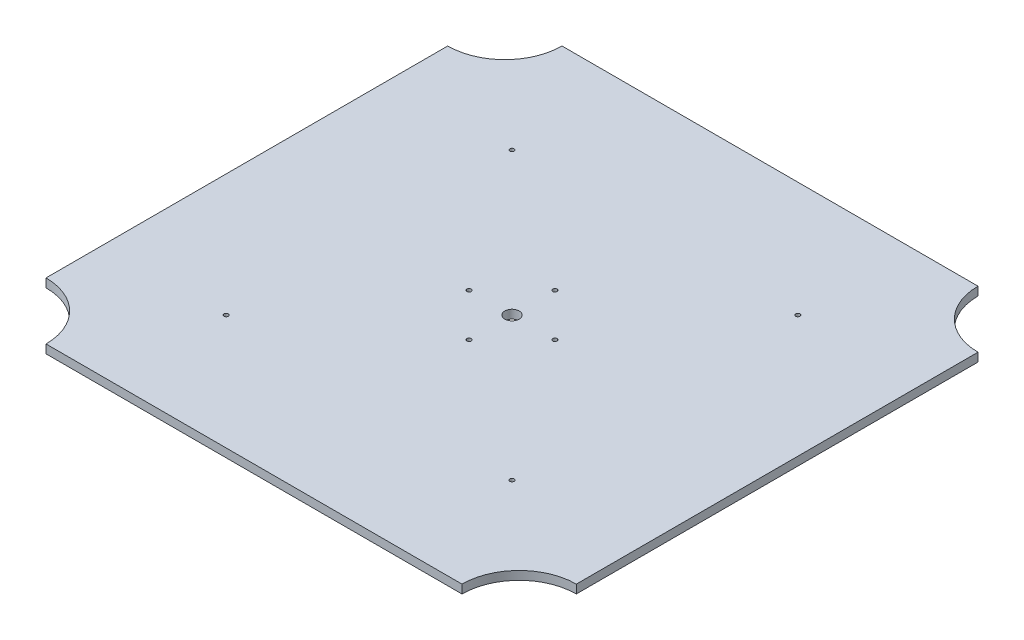
ISO-10303-21;
HEADER;
FILE_DESCRIPTION(('STEP AP214'),'2;1');
FILE_NAME('part.step','',(''),(''),'','','');
FILE_SCHEMA(('AUTOMOTIVE_DESIGN { 1 0 10303 214 1 1 1 1 }'));
ENDSEC;
DATA;
#1=APPLICATION_CONTEXT('core data for automotive mechanical design processes');
#2=APPLICATION_PROTOCOL_DEFINITION('international standard','automotive_design',2000,#1);
#3=PRODUCT_CONTEXT('',#1,'mechanical');
#4=PRODUCT('Part','Part','',(#3));
#5=PRODUCT_RELATED_PRODUCT_CATEGORY('part','',(#4));
#6=PRODUCT_DEFINITION_FORMATION('','',#4);
#7=PRODUCT_DEFINITION_CONTEXT('part definition',#1,'design');
#8=PRODUCT_DEFINITION('design','',#6,#7);
#9=PRODUCT_DEFINITION_SHAPE('','',#8);
#10=(LENGTH_UNIT() NAMED_UNIT(*) SI_UNIT(.MILLI.,.METRE.));
#11=(NAMED_UNIT(*) PLANE_ANGLE_UNIT() SI_UNIT($,.RADIAN.));
#12=(NAMED_UNIT(*) SI_UNIT($,.STERADIAN.) SOLID_ANGLE_UNIT());
#13=UNCERTAINTY_MEASURE_WITH_UNIT(LENGTH_MEASURE(1.E-05),#10,'distance_accuracy_value','');
#14=(GEOMETRIC_REPRESENTATION_CONTEXT(3) GLOBAL_UNCERTAINTY_ASSIGNED_CONTEXT((#13)) GLOBAL_UNIT_ASSIGNED_CONTEXT((#10,
#11,#12)) REPRESENTATION_CONTEXT('',''));
#15=CARTESIAN_POINT('',(0.,0.,0.));
#16=DIRECTION('',(0.,0.,1.));
#17=DIRECTION('',(1.,0.,0.));
#18=AXIS2_PLACEMENT_3D('',#15,#16,#17);
#19=CARTESIAN_POINT('',(-185.5,6.,-180.5));
#20=DIRECTION('',(0.,1.,0.));
#21=DIRECTION('',(0.,0.,1.));
#22=AXIS2_PLACEMENT_3D('',#19,#20,#21);
#23=PLANE('',#22);
#24=CARTESIAN_POINT('',(100.,6.,100.));
#25=DIRECTION('',(0.,1.,0.));
#26=DIRECTION('',(0.,0.,1.));
#27=AXIS2_PLACEMENT_3D('',#24,#25,#26);
#28=CIRCLE('',#27,1.5);
#29=CARTESIAN_POINT('',(100.,6.,101.5));
#30=VERTEX_POINT('',#29);
#31=EDGE_CURVE('E224',#30,#30,#28,.T.);
#32=ORIENTED_EDGE('',*,*,#31,.F.);
#33=EDGE_LOOP('',(#32));
#34=FACE_BOUND('',#33,.T.);
#35=CARTESIAN_POINT('',(-100.,6.,-100.));
#36=DIRECTION('',(0.,1.,0.));
#37=DIRECTION('',(0.,0.,1.));
#38=AXIS2_PLACEMENT_3D('',#35,#36,#37);
#39=CIRCLE('',#38,1.5);
#40=CARTESIAN_POINT('',(-100.,6.,-98.5));
#41=VERTEX_POINT('',#40);
#42=EDGE_CURVE('E212',#41,#41,#39,.T.);
#43=ORIENTED_EDGE('',*,*,#42,.F.);
#44=EDGE_LOOP('',(#43));
#45=FACE_BOUND('',#44,.T.);
#46=CARTESIAN_POINT('',(3.24614485689774E-11,6.,30.));
#47=DIRECTION('',(0.,1.,0.));
#48=DIRECTION('',(0.,0.,1.));
#49=AXIS2_PLACEMENT_3D('',#46,#47,#48);
#50=CIRCLE('',#49,1.50000000003126);
#51=CARTESIAN_POINT('',(3.24614485689774E-11,6.,31.5000000000313));
#52=VERTEX_POINT('',#51);
#53=EDGE_CURVE('E200',#52,#52,#50,.T.);
#54=ORIENTED_EDGE('',*,*,#53,.F.);
#55=EDGE_LOOP('',(#54));
#56=FACE_BOUND('',#55,.T.);
#57=CARTESIAN_POINT('',(0.,6.,-30.));
#58=DIRECTION('',(0.,1.,0.));
#59=DIRECTION('',(0.,0.,1.));
#60=AXIS2_PLACEMENT_3D('',#57,#58,#59);
#61=CIRCLE('',#60,1.5);
#62=CARTESIAN_POINT('',(0.,6.,-28.5));
#63=VERTEX_POINT('',#62);
#64=EDGE_CURVE('E188',#63,#63,#61,.T.);
#65=ORIENTED_EDGE('',*,*,#64,.F.);
#66=EDGE_LOOP('',(#65));
#67=FACE_BOUND('',#66,.T.);
#68=CARTESIAN_POINT('',(-185.5,6.,-180.5));
#69=DIRECTION('',(0.,-1.,0.));
#70=DIRECTION('',(0.,0.,1.));
#71=AXIS2_PLACEMENT_3D('',#68,#69,#70);
#72=CIRCLE('',#71,40.);
#73=CARTESIAN_POINT('',(-145.5,6.,-180.5));
#74=VERTEX_POINT('',#73);
#75=CARTESIAN_POINT('',(-185.5,6.,-140.5));
#76=VERTEX_POINT('',#75);
#77=EDGE_CURVE('E151',#74,#76,#72,.T.);
#78=ORIENTED_EDGE('',*,*,#77,.T.);
#79=DIRECTION('',(0.,0.,1.));
#80=VECTOR('',#79,1.);
#81=CARTESIAN_POINT('',(-185.5,6.,-140.5));
#82=LINE('',#81,#80);
#83=CARTESIAN_POINT('',(-185.5,6.,140.5));
#84=VERTEX_POINT('',#83);
#85=EDGE_CURVE('E99',#76,#84,#82,.T.);
#86=ORIENTED_EDGE('',*,*,#85,.T.);
#87=CARTESIAN_POINT('',(-185.5,6.,180.5));
#88=DIRECTION('',(0.,-1.,0.));
#89=DIRECTION('',(0.,0.,1.));
#90=AXIS2_PLACEMENT_3D('',#87,#88,#89);
#91=CIRCLE('',#90,40.);
#92=CARTESIAN_POINT('',(-145.5,6.,180.5));
#93=VERTEX_POINT('',#92);
#94=EDGE_CURVE('E166',#84,#93,#91,.T.);
#95=ORIENTED_EDGE('',*,*,#94,.T.);
#96=DIRECTION('',(1.,0.,0.));
#97=VECTOR('',#96,1.);
#98=CARTESIAN_POINT('',(-145.5,6.,180.5));
#99=LINE('',#98,#97);
#100=CARTESIAN_POINT('',(145.5,6.,180.5));
#101=VERTEX_POINT('',#100);
#102=EDGE_CURVE('E179',#93,#101,#99,.T.);
#103=ORIENTED_EDGE('',*,*,#102,.T.);
#104=CARTESIAN_POINT('',(185.5,6.,180.5));
#105=DIRECTION('',(0.,-1.,0.));
#106=DIRECTION('',(0.,0.,1.));
#107=AXIS2_PLACEMENT_3D('',#104,#105,#106);
#108=CIRCLE('',#107,40.);
#109=CARTESIAN_POINT('',(185.5,6.,140.5));
#110=VERTEX_POINT('',#109);
#111=EDGE_CURVE('E118',#101,#110,#108,.T.);
#112=ORIENTED_EDGE('',*,*,#111,.T.);
#113=DIRECTION('',(0.,0.,-1.));
#114=VECTOR('',#113,1.);
#115=CARTESIAN_POINT('',(185.5,6.,-140.5));
#116=LINE('',#115,#114);
#117=CARTESIAN_POINT('',(185.5,6.,-140.5));
#118=VERTEX_POINT('',#117);
#119=EDGE_CURVE('E112',#110,#118,#116,.T.);
#120=ORIENTED_EDGE('',*,*,#119,.T.);
#121=CARTESIAN_POINT('',(185.5,6.,-180.5));
#122=DIRECTION('',(0.,-1.,0.));
#123=DIRECTION('',(0.,0.,1.));
#124=AXIS2_PLACEMENT_3D('',#121,#122,#123);
#125=CIRCLE('',#124,40.);
#126=CARTESIAN_POINT('',(145.5,6.,-180.5));
#127=VERTEX_POINT('',#126);
#128=EDGE_CURVE('E116',#118,#127,#125,.T.);
#129=ORIENTED_EDGE('',*,*,#128,.T.);
#130=DIRECTION('',(-1.,0.,0.));
#131=VECTOR('',#130,1.);
#132=CARTESIAN_POINT('',(-145.5,6.,-180.5));
#133=LINE('',#132,#131);
#134=EDGE_CURVE('E56',#127,#74,#133,.T.);
#135=ORIENTED_EDGE('',*,*,#134,.T.);
#136=EDGE_LOOP('',(#78,#86,#95,#103,#112,#120,#129,#135));
#137=FACE_BOUND('',#136,.T.);
#138=CARTESIAN_POINT('',(0.,6.,0.));
#139=DIRECTION('',(0.,1.,0.));
#140=DIRECTION('',(0.,0.,1.));
#141=AXIS2_PLACEMENT_3D('',#138,#139,#140);
#142=CIRCLE('',#141,5.);
#143=CARTESIAN_POINT('',(0.,6.,5.));
#144=VERTEX_POINT('',#143);
#145=EDGE_CURVE('E140',#144,#144,#142,.T.);
#146=ORIENTED_EDGE('',*,*,#145,.F.);
#147=EDGE_LOOP('',(#146));
#148=FACE_BOUND('',#147,.T.);
#149=CARTESIAN_POINT('',(30.0000000000162,6.,-1.62215088173251E-11));
#150=DIRECTION('',(0.,1.,0.));
#151=DIRECTION('',(0.,0.,1.));
#152=AXIS2_PLACEMENT_3D('',#149,#150,#151);
#153=CIRCLE('',#152,1.50000000001089);
#154=CARTESIAN_POINT('',(30.0000000000162,6.,1.49999999999467));
#155=VERTEX_POINT('',#154);
#156=EDGE_CURVE('E194',#155,#155,#153,.T.);
#157=ORIENTED_EDGE('',*,*,#156,.F.);
#158=EDGE_LOOP('',(#157));
#159=FACE_BOUND('',#158,.T.);
#160=CARTESIAN_POINT('',(-29.9999999999838,6.,1.62251827577226E-11));
#161=DIRECTION('',(0.,1.,0.));
#162=DIRECTION('',(0.,0.,1.));
#163=AXIS2_PLACEMENT_3D('',#160,#161,#162);
#164=CIRCLE('',#163,1.50000000002058);
#165=CARTESIAN_POINT('',(-29.9999999999838,6.,1.50000000003681));
#166=VERTEX_POINT('',#165);
#167=EDGE_CURVE('E206',#166,#166,#164,.T.);
#168=ORIENTED_EDGE('',*,*,#167,.F.);
#169=EDGE_LOOP('',(#168));
#170=FACE_BOUND('',#169,.T.);
#171=CARTESIAN_POINT('',(100.,6.,-100.));
#172=DIRECTION('',(0.,1.,0.));
#173=DIRECTION('',(0.,0.,1.));
#174=AXIS2_PLACEMENT_3D('',#171,#172,#173);
#175=CIRCLE('',#174,1.5);
#176=CARTESIAN_POINT('',(100.,6.,-98.5));
#177=VERTEX_POINT('',#176);
#178=EDGE_CURVE('E218',#177,#177,#175,.T.);
#179=ORIENTED_EDGE('',*,*,#178,.F.);
#180=EDGE_LOOP('',(#179));
#181=FACE_BOUND('',#180,.T.);
#182=CARTESIAN_POINT('',(-100.,6.,100.));
#183=DIRECTION('',(0.,1.,0.));
#184=DIRECTION('',(0.,0.,1.));
#185=AXIS2_PLACEMENT_3D('',#182,#183,#184);
#186=CIRCLE('',#185,1.5);
#187=CARTESIAN_POINT('',(-100.,6.,101.5));
#188=VERTEX_POINT('',#187);
#189=EDGE_CURVE('E230',#188,#188,#186,.T.);
#190=ORIENTED_EDGE('',*,*,#189,.F.);
#191=EDGE_LOOP('',(#190));
#192=FACE_BOUND('',#191,.T.);
#193=ADVANCED_FACE('F39',(#34,#45,#56,#67,#137,#148,#159,#170,#181,#192),#23,.T.);
#194=CARTESIAN_POINT('',(-185.5,0.,-180.5));
#195=DIRECTION('',(0.,1.,0.));
#196=DIRECTION('',(0.,0.,1.));
#197=AXIS2_PLACEMENT_3D('',#194,#195,#196);
#198=PLANE('',#197);
#199=CARTESIAN_POINT('',(-185.5,0.,-180.5));
#200=DIRECTION('',(0.,-1.,0.));
#201=DIRECTION('',(0.,0.,1.));
#202=AXIS2_PLACEMENT_3D('',#199,#200,#201);
#203=CIRCLE('',#202,40.);
#204=CARTESIAN_POINT('',(-145.5,0.,-180.5));
#205=VERTEX_POINT('',#204);
#206=CARTESIAN_POINT('',(-185.5,0.,-140.5));
#207=VERTEX_POINT('',#206);
#208=EDGE_CURVE('E136',#205,#207,#203,.T.);
#209=ORIENTED_EDGE('',*,*,#208,.F.);
#210=DIRECTION('',(-1.,0.,0.));
#211=VECTOR('',#210,1.);
#212=CARTESIAN_POINT('',(-145.5,0.,-180.5));
#213=LINE('',#212,#211);
#214=CARTESIAN_POINT('',(145.5,0.,-180.5));
#215=VERTEX_POINT('',#214);
#216=EDGE_CURVE('E91',#215,#205,#213,.T.);
#217=ORIENTED_EDGE('',*,*,#216,.F.);
#218=CARTESIAN_POINT('',(185.5,0.,-180.5));
#219=DIRECTION('',(0.,-1.,0.));
#220=DIRECTION('',(0.,0.,1.));
#221=AXIS2_PLACEMENT_3D('',#218,#219,#220);
#222=CIRCLE('',#221,40.);
#223=CARTESIAN_POINT('',(185.5,0.,-140.5));
#224=VERTEX_POINT('',#223);
#225=EDGE_CURVE('E85',#224,#215,#222,.T.);
#226=ORIENTED_EDGE('',*,*,#225,.F.);
#227=DIRECTION('',(0.,0.,-1.));
#228=VECTOR('',#227,1.);
#229=CARTESIAN_POINT('',(185.5,0.,-140.5));
#230=LINE('',#229,#228);
#231=CARTESIAN_POINT('',(185.5,0.,140.5));
#232=VERTEX_POINT('',#231);
#233=EDGE_CURVE('E126',#232,#224,#230,.T.);
#234=ORIENTED_EDGE('',*,*,#233,.F.);
#235=CARTESIAN_POINT('',(185.5,0.,180.5));
#236=DIRECTION('',(0.,-1.,0.));
#237=DIRECTION('',(0.,0.,1.));
#238=AXIS2_PLACEMENT_3D('',#235,#236,#237);
#239=CIRCLE('',#238,40.);
#240=CARTESIAN_POINT('',(145.5,0.,180.5));
#241=VERTEX_POINT('',#240);
#242=EDGE_CURVE('E146',#241,#232,#239,.T.);
#243=ORIENTED_EDGE('',*,*,#242,.F.);
#244=DIRECTION('',(1.,0.,0.));
#245=VECTOR('',#244,1.);
#246=CARTESIAN_POINT('',(-145.5,0.,180.5));
#247=LINE('',#246,#245);
#248=CARTESIAN_POINT('',(-145.5,0.,180.5));
#249=VERTEX_POINT('',#248);
#250=EDGE_CURVE('E144',#249,#241,#247,.T.);
#251=ORIENTED_EDGE('',*,*,#250,.F.);
#252=CARTESIAN_POINT('',(-185.5,0.,180.5));
#253=DIRECTION('',(0.,-1.,0.));
#254=DIRECTION('',(0.,0.,1.));
#255=AXIS2_PLACEMENT_3D('',#252,#253,#254);
#256=CIRCLE('',#255,40.);
#257=CARTESIAN_POINT('',(-185.5,0.,140.5));
#258=VERTEX_POINT('',#257);
#259=EDGE_CURVE('E142',#258,#249,#256,.T.);
#260=ORIENTED_EDGE('',*,*,#259,.F.);
#261=DIRECTION('',(0.,0.,1.));
#262=VECTOR('',#261,1.);
#263=CARTESIAN_POINT('',(-185.5,0.,-140.5));
#264=LINE('',#263,#262);
#265=EDGE_CURVE('E139',#207,#258,#264,.T.);
#266=ORIENTED_EDGE('',*,*,#265,.F.);
#267=EDGE_LOOP('',(#209,#217,#226,#234,#243,#251,#260,#266));
#268=FACE_BOUND('',#267,.T.);
#269=CARTESIAN_POINT('',(0.,0.,0.));
#270=DIRECTION('',(0.,1.,0.));
#271=DIRECTION('',(0.,0.,1.));
#272=AXIS2_PLACEMENT_3D('',#269,#270,#271);
#273=CIRCLE('',#272,5.);
#274=CARTESIAN_POINT('',(0.,0.,5.));
#275=VERTEX_POINT('',#274);
#276=EDGE_CURVE('E185',#275,#275,#273,.T.);
#277=ORIENTED_EDGE('',*,*,#276,.T.);
#278=EDGE_LOOP('',(#277));
#279=FACE_BOUND('',#278,.T.);
#280=CARTESIAN_POINT('',(0.,0.,-30.));
#281=DIRECTION('',(0.,1.,0.));
#282=DIRECTION('',(0.,0.,1.));
#283=AXIS2_PLACEMENT_3D('',#280,#281,#282);
#284=CIRCLE('',#283,1.5);
#285=CARTESIAN_POINT('',(0.,0.,-28.5));
#286=VERTEX_POINT('',#285);
#287=EDGE_CURVE('E191',#286,#286,#284,.T.);
#288=ORIENTED_EDGE('',*,*,#287,.T.);
#289=EDGE_LOOP('',(#288));
#290=FACE_BOUND('',#289,.T.);
#291=CARTESIAN_POINT('',(30.0000000000162,0.,-1.62215088173251E-11));
#292=DIRECTION('',(0.,1.,0.));
#293=DIRECTION('',(0.,0.,1.));
#294=AXIS2_PLACEMENT_3D('',#291,#292,#293);
#295=CIRCLE('',#294,1.50000000001089);
#296=CARTESIAN_POINT('',(30.0000000000162,0.,1.49999999999467));
#297=VERTEX_POINT('',#296);
#298=EDGE_CURVE('E197',#297,#297,#295,.T.);
#299=ORIENTED_EDGE('',*,*,#298,.T.);
#300=EDGE_LOOP('',(#299));
#301=FACE_BOUND('',#300,.T.);
#302=CARTESIAN_POINT('',(3.24614485689774E-11,0.,30.));
#303=DIRECTION('',(0.,1.,0.));
#304=DIRECTION('',(0.,0.,1.));
#305=AXIS2_PLACEMENT_3D('',#302,#303,#304);
#306=CIRCLE('',#305,1.50000000003126);
#307=CARTESIAN_POINT('',(3.24614485689774E-11,0.,31.5000000000313));
#308=VERTEX_POINT('',#307);
#309=EDGE_CURVE('E203',#308,#308,#306,.T.);
#310=ORIENTED_EDGE('',*,*,#309,.T.);
#311=EDGE_LOOP('',(#310));
#312=FACE_BOUND('',#311,.T.);
#313=CARTESIAN_POINT('',(-29.9999999999838,0.,1.62251827577226E-11));
#314=DIRECTION('',(0.,1.,0.));
#315=DIRECTION('',(0.,0.,1.));
#316=AXIS2_PLACEMENT_3D('',#313,#314,#315);
#317=CIRCLE('',#316,1.50000000002058);
#318=CARTESIAN_POINT('',(-29.9999999999838,0.,1.50000000003681));
#319=VERTEX_POINT('',#318);
#320=EDGE_CURVE('E209',#319,#319,#317,.T.);
#321=ORIENTED_EDGE('',*,*,#320,.T.);
#322=EDGE_LOOP('',(#321));
#323=FACE_BOUND('',#322,.T.);
#324=CARTESIAN_POINT('',(-100.,0.,-100.));
#325=DIRECTION('',(0.,1.,0.));
#326=DIRECTION('',(0.,0.,1.));
#327=AXIS2_PLACEMENT_3D('',#324,#325,#326);
#328=CIRCLE('',#327,1.5);
#329=CARTESIAN_POINT('',(-100.,0.,-98.5));
#330=VERTEX_POINT('',#329);
#331=EDGE_CURVE('E215',#330,#330,#328,.T.);
#332=ORIENTED_EDGE('',*,*,#331,.T.);
#333=EDGE_LOOP('',(#332));
#334=FACE_BOUND('',#333,.T.);
#335=CARTESIAN_POINT('',(100.,0.,-100.));
#336=DIRECTION('',(0.,1.,0.));
#337=DIRECTION('',(0.,0.,1.));
#338=AXIS2_PLACEMENT_3D('',#335,#336,#337);
#339=CIRCLE('',#338,1.5);
#340=CARTESIAN_POINT('',(100.,0.,-98.5));
#341=VERTEX_POINT('',#340);
#342=EDGE_CURVE('E221',#341,#341,#339,.T.);
#343=ORIENTED_EDGE('',*,*,#342,.T.);
#344=EDGE_LOOP('',(#343));
#345=FACE_BOUND('',#344,.T.);
#346=CARTESIAN_POINT('',(100.,0.,100.));
#347=DIRECTION('',(0.,1.,0.));
#348=DIRECTION('',(0.,0.,1.));
#349=AXIS2_PLACEMENT_3D('',#346,#347,#348);
#350=CIRCLE('',#349,1.5);
#351=CARTESIAN_POINT('',(100.,0.,101.5));
#352=VERTEX_POINT('',#351);
#353=EDGE_CURVE('E227',#352,#352,#350,.T.);
#354=ORIENTED_EDGE('',*,*,#353,.T.);
#355=EDGE_LOOP('',(#354));
#356=FACE_BOUND('',#355,.T.);
#357=CARTESIAN_POINT('',(-100.,0.,100.));
#358=DIRECTION('',(0.,1.,0.));
#359=DIRECTION('',(0.,0.,1.));
#360=AXIS2_PLACEMENT_3D('',#357,#358,#359);
#361=CIRCLE('',#360,1.5);
#362=CARTESIAN_POINT('',(-100.,0.,101.5));
#363=VERTEX_POINT('',#362);
#364=EDGE_CURVE('E233',#363,#363,#361,.T.);
#365=ORIENTED_EDGE('',*,*,#364,.T.);
#366=EDGE_LOOP('',(#365));
#367=FACE_BOUND('',#366,.T.);
#368=ADVANCED_FACE('F170',(#268,#279,#290,#301,#312,#323,#334,#345,#356,#367),#198,.F.);
#369=CARTESIAN_POINT('',(-185.5,6.,-180.5));
#370=DIRECTION('',(0.,-1.,0.));
#371=DIRECTION('',(0.,0.,-1.));
#372=AXIS2_PLACEMENT_3D('',#369,#370,#371);
#373=CYLINDRICAL_SURFACE('',#372,40.);
#374=ORIENTED_EDGE('',*,*,#208,.T.);
#375=DIRECTION('',(0.,-1.,0.));
#376=VECTOR('',#375,1.);
#377=CARTESIAN_POINT('',(-185.5,6.,-140.5));
#378=LINE('',#377,#376);
#379=EDGE_CURVE('E11',#76,#207,#378,.T.);
#380=ORIENTED_EDGE('',*,*,#379,.F.);
#381=ORIENTED_EDGE('',*,*,#77,.F.);
#382=DIRECTION('',(0.,-1.,0.));
#383=VECTOR('',#382,1.);
#384=CARTESIAN_POINT('',(-145.5,6.,-180.5));
#385=LINE('',#384,#383);
#386=EDGE_CURVE('E132',#74,#205,#385,.T.);
#387=ORIENTED_EDGE('',*,*,#386,.T.);
#388=EDGE_LOOP('',(#374,#380,#381,#387));
#389=FACE_BOUND('',#388,.T.);
#390=ADVANCED_FACE('F41',(#389),#373,.F.);
#391=CARTESIAN_POINT('',(-185.5,6.,-140.5));
#392=DIRECTION('',(1.,0.,0.));
#393=DIRECTION('',(0.,0.,-1.));
#394=AXIS2_PLACEMENT_3D('',#391,#392,#393);
#395=PLANE('',#394);
#396=ORIENTED_EDGE('',*,*,#265,.T.);
#397=DIRECTION('',(0.,-1.,0.));
#398=VECTOR('',#397,1.);
#399=CARTESIAN_POINT('',(-185.5,6.,140.5));
#400=LINE('',#399,#398);
#401=EDGE_CURVE('E48',#84,#258,#400,.T.);
#402=ORIENTED_EDGE('',*,*,#401,.F.);
#403=ORIENTED_EDGE('',*,*,#85,.F.);
#404=ORIENTED_EDGE('',*,*,#379,.T.);
#405=EDGE_LOOP('',(#396,#402,#403,#404));
#406=FACE_BOUND('',#405,.T.);
#407=ADVANCED_FACE('F267',(#406),#395,.F.);
#408=CARTESIAN_POINT('',(-185.5,6.,180.5));
#409=DIRECTION('',(0.,-1.,0.));
#410=DIRECTION('',(0.,0.,-1.));
#411=AXIS2_PLACEMENT_3D('',#408,#409,#410);
#412=CYLINDRICAL_SURFACE('',#411,40.);
#413=ORIENTED_EDGE('',*,*,#259,.T.);
#414=DIRECTION('',(0.,-1.,0.));
#415=VECTOR('',#414,1.);
#416=CARTESIAN_POINT('',(-145.5,6.,180.5));
#417=LINE('',#416,#415);
#418=EDGE_CURVE('E158',#93,#249,#417,.T.);
#419=ORIENTED_EDGE('',*,*,#418,.F.);
#420=ORIENTED_EDGE('',*,*,#94,.F.);
#421=ORIENTED_EDGE('',*,*,#401,.T.);
#422=EDGE_LOOP('',(#413,#419,#420,#421));
#423=FACE_BOUND('',#422,.T.);
#424=ADVANCED_FACE('F164',(#423),#412,.F.);
#425=CARTESIAN_POINT('',(-145.5,6.,180.5));
#426=DIRECTION('',(0.,0.,-1.));
#427=DIRECTION('',(-1.,0.,0.));
#428=AXIS2_PLACEMENT_3D('',#425,#426,#427);
#429=PLANE('',#428);
#430=ORIENTED_EDGE('',*,*,#250,.T.);
#431=DIRECTION('',(0.,-1.,0.));
#432=VECTOR('',#431,1.);
#433=CARTESIAN_POINT('',(145.5,6.,180.5));
#434=LINE('',#433,#432);
#435=EDGE_CURVE('E155',#101,#241,#434,.T.);
#436=ORIENTED_EDGE('',*,*,#435,.F.);
#437=ORIENTED_EDGE('',*,*,#102,.F.);
#438=ORIENTED_EDGE('',*,*,#418,.T.);
#439=EDGE_LOOP('',(#430,#436,#437,#438));
#440=FACE_BOUND('',#439,.T.);
#441=ADVANCED_FACE('F175',(#440),#429,.F.);
#442=CARTESIAN_POINT('',(185.5,6.,180.5));
#443=DIRECTION('',(0.,-1.,0.));
#444=DIRECTION('',(0.,0.,-1.));
#445=AXIS2_PLACEMENT_3D('',#442,#443,#444);
#446=CYLINDRICAL_SURFACE('',#445,40.);
#447=ORIENTED_EDGE('',*,*,#242,.T.);
#448=DIRECTION('',(0.,-1.,0.));
#449=VECTOR('',#448,1.);
#450=CARTESIAN_POINT('',(185.5,6.,140.5));
#451=LINE('',#450,#449);
#452=EDGE_CURVE('E127',#110,#232,#451,.T.);
#453=ORIENTED_EDGE('',*,*,#452,.F.);
#454=ORIENTED_EDGE('',*,*,#111,.F.);
#455=ORIENTED_EDGE('',*,*,#435,.T.);
#456=EDGE_LOOP('',(#447,#453,#454,#455));
#457=FACE_BOUND('',#456,.T.);
#458=ADVANCED_FACE('F178',(#457),#446,.F.);
#459=CARTESIAN_POINT('',(185.5,6.,-140.5));
#460=DIRECTION('',(-1.,0.,0.));
#461=DIRECTION('',(0.,0.,1.));
#462=AXIS2_PLACEMENT_3D('',#459,#460,#461);
#463=PLANE('',#462);
#464=ORIENTED_EDGE('',*,*,#233,.T.);
#465=DIRECTION('',(0.,-1.,0.));
#466=VECTOR('',#465,1.);
#467=CARTESIAN_POINT('',(185.5,6.,-140.5));
#468=LINE('',#467,#466);
#469=EDGE_CURVE('E123',#118,#224,#468,.T.);
#470=ORIENTED_EDGE('',*,*,#469,.F.);
#471=ORIENTED_EDGE('',*,*,#119,.F.);
#472=ORIENTED_EDGE('',*,*,#452,.T.);
#473=EDGE_LOOP('',(#464,#470,#471,#472));
#474=FACE_BOUND('',#473,.T.);
#475=ADVANCED_FACE('F124',(#474),#463,.F.);
#476=CARTESIAN_POINT('',(185.5,6.,-180.5));
#477=DIRECTION('',(0.,-1.,0.));
#478=DIRECTION('',(0.,0.,-1.));
#479=AXIS2_PLACEMENT_3D('',#476,#477,#478);
#480=CYLINDRICAL_SURFACE('',#479,40.);
#481=ORIENTED_EDGE('',*,*,#225,.T.);
#482=DIRECTION('',(0.,-1.,0.));
#483=VECTOR('',#482,1.);
#484=CARTESIAN_POINT('',(145.5,6.,-180.5));
#485=LINE('',#484,#483);
#486=EDGE_CURVE('E128',#127,#215,#485,.T.);
#487=ORIENTED_EDGE('',*,*,#486,.F.);
#488=ORIENTED_EDGE('',*,*,#128,.F.);
#489=ORIENTED_EDGE('',*,*,#469,.T.);
#490=EDGE_LOOP('',(#481,#487,#488,#489));
#491=FACE_BOUND('',#490,.T.);
#492=ADVANCED_FACE('F130',(#491),#480,.F.);
#493=CARTESIAN_POINT('',(-145.5,6.,-180.5));
#494=DIRECTION('',(0.,0.,1.));
#495=DIRECTION('',(1.,0.,0.));
#496=AXIS2_PLACEMENT_3D('',#493,#494,#495);
#497=PLANE('',#496);
#498=ORIENTED_EDGE('',*,*,#216,.T.);
#499=ORIENTED_EDGE('',*,*,#386,.F.);
#500=ORIENTED_EDGE('',*,*,#134,.F.);
#501=ORIENTED_EDGE('',*,*,#486,.T.);
#502=EDGE_LOOP('',(#498,#499,#500,#501));
#503=FACE_BOUND('',#502,.T.);
#504=ADVANCED_FACE('F255',(#503),#497,.F.);
#505=CARTESIAN_POINT('',(0.,6.,0.));
#506=DIRECTION('',(0.,-1.,0.));
#507=DIRECTION('',(0.,0.,-1.));
#508=AXIS2_PLACEMENT_3D('',#505,#506,#507);
#509=CYLINDRICAL_SURFACE('',#508,5.);
#510=ORIENTED_EDGE('',*,*,#145,.T.);
#511=EDGE_LOOP('',(#510));
#512=FACE_BOUND('',#511,.T.);
#513=ORIENTED_EDGE('',*,*,#276,.F.);
#514=EDGE_LOOP('',(#513));
#515=FACE_BOUND('',#514,.T.);
#516=ADVANCED_FACE('F252',(#512,#515),#509,.F.);
#517=CARTESIAN_POINT('',(0.,6.,-30.));
#518=DIRECTION('',(0.,-1.,0.));
#519=DIRECTION('',(0.,0.,-1.));
#520=AXIS2_PLACEMENT_3D('',#517,#518,#519);
#521=CYLINDRICAL_SURFACE('',#520,1.5);
#522=ORIENTED_EDGE('',*,*,#64,.T.);
#523=EDGE_LOOP('',(#522));
#524=FACE_BOUND('',#523,.T.);
#525=ORIENTED_EDGE('',*,*,#287,.F.);
#526=EDGE_LOOP('',(#525));
#527=FACE_BOUND('',#526,.T.);
#528=ADVANCED_FACE('F343',(#524,#527),#521,.F.);
#529=CARTESIAN_POINT('',(30.0000000000162,6.,-1.62215088173251E-11));
#530=DIRECTION('',(0.,-1.,0.));
#531=DIRECTION('',(0.,0.,-1.));
#532=AXIS2_PLACEMENT_3D('',#529,#530,#531);
#533=CYLINDRICAL_SURFACE('',#532,1.50000000001089);
#534=ORIENTED_EDGE('',*,*,#156,.T.);
#535=EDGE_LOOP('',(#534));
#536=FACE_BOUND('',#535,.T.);
#537=ORIENTED_EDGE('',*,*,#298,.F.);
#538=EDGE_LOOP('',(#537));
#539=FACE_BOUND('',#538,.T.);
#540=ADVANCED_FACE('F352',(#536,#539),#533,.F.);
#541=CARTESIAN_POINT('',(3.24614485689774E-11,6.,30.));
#542=DIRECTION('',(0.,-1.,0.));
#543=DIRECTION('',(0.,0.,-1.));
#544=AXIS2_PLACEMENT_3D('',#541,#542,#543);
#545=CYLINDRICAL_SURFACE('',#544,1.50000000003126);
#546=ORIENTED_EDGE('',*,*,#53,.T.);
#547=EDGE_LOOP('',(#546));
#548=FACE_BOUND('',#547,.T.);
#549=ORIENTED_EDGE('',*,*,#309,.F.);
#550=EDGE_LOOP('',(#549));
#551=FACE_BOUND('',#550,.T.);
#552=ADVANCED_FACE('F361',(#548,#551),#545,.F.);
#553=CARTESIAN_POINT('',(-29.9999999999838,6.,1.62251827577226E-11));
#554=DIRECTION('',(0.,-1.,0.));
#555=DIRECTION('',(0.,0.,-1.));
#556=AXIS2_PLACEMENT_3D('',#553,#554,#555);
#557=CYLINDRICAL_SURFACE('',#556,1.50000000002058);
#558=ORIENTED_EDGE('',*,*,#167,.T.);
#559=EDGE_LOOP('',(#558));
#560=FACE_BOUND('',#559,.T.);
#561=ORIENTED_EDGE('',*,*,#320,.F.);
#562=EDGE_LOOP('',(#561));
#563=FACE_BOUND('',#562,.T.);
#564=ADVANCED_FACE('F371',(#560,#563),#557,.F.);
#565=CARTESIAN_POINT('',(-100.,6.,-100.));
#566=DIRECTION('',(0.,-1.,0.));
#567=DIRECTION('',(0.,0.,-1.));
#568=AXIS2_PLACEMENT_3D('',#565,#566,#567);
#569=CYLINDRICAL_SURFACE('',#568,1.5);
#570=ORIENTED_EDGE('',*,*,#42,.T.);
#571=EDGE_LOOP('',(#570));
#572=FACE_BOUND('',#571,.T.);
#573=ORIENTED_EDGE('',*,*,#331,.F.);
#574=EDGE_LOOP('',(#573));
#575=FACE_BOUND('',#574,.T.);
#576=ADVANCED_FACE('F381',(#572,#575),#569,.F.);
#577=CARTESIAN_POINT('',(100.,6.,-100.));
#578=DIRECTION('',(0.,-1.,0.));
#579=DIRECTION('',(0.,0.,-1.));
#580=AXIS2_PLACEMENT_3D('',#577,#578,#579);
#581=CYLINDRICAL_SURFACE('',#580,1.5);
#582=ORIENTED_EDGE('',*,*,#178,.T.);
#583=EDGE_LOOP('',(#582));
#584=FACE_BOUND('',#583,.T.);
#585=ORIENTED_EDGE('',*,*,#342,.F.);
#586=EDGE_LOOP('',(#585));
#587=FACE_BOUND('',#586,.T.);
#588=ADVANCED_FACE('F391',(#584,#587),#581,.F.);
#589=CARTESIAN_POINT('',(100.,6.,100.));
#590=DIRECTION('',(0.,-1.,0.));
#591=DIRECTION('',(0.,0.,-1.));
#592=AXIS2_PLACEMENT_3D('',#589,#590,#591);
#593=CYLINDRICAL_SURFACE('',#592,1.5);
#594=ORIENTED_EDGE('',*,*,#31,.T.);
#595=EDGE_LOOP('',(#594));
#596=FACE_BOUND('',#595,.T.);
#597=ORIENTED_EDGE('',*,*,#353,.F.);
#598=EDGE_LOOP('',(#597));
#599=FACE_BOUND('',#598,.T.);
#600=ADVANCED_FACE('F401',(#596,#599),#593,.F.);
#601=CARTESIAN_POINT('',(-100.,6.,100.));
#602=DIRECTION('',(0.,-1.,0.));
#603=DIRECTION('',(0.,0.,-1.));
#604=AXIS2_PLACEMENT_3D('',#601,#602,#603);
#605=CYLINDRICAL_SURFACE('',#604,1.5);
#606=ORIENTED_EDGE('',*,*,#189,.T.);
#607=EDGE_LOOP('',(#606));
#608=FACE_BOUND('',#607,.T.);
#609=ORIENTED_EDGE('',*,*,#364,.F.);
#610=EDGE_LOOP('',(#609));
#611=FACE_BOUND('',#610,.T.);
#612=ADVANCED_FACE('F239',(#608,#611),#605,.F.);
#613=CLOSED_SHELL('',(#193,#368,#390,#407,#424,#441,#458,#475,#492,#504,#516,#528,#540,#552,
#564,#576,#588,#600,#612));
#614=MANIFOLD_SOLID_BREP('B2',#613);
#615=ADVANCED_BREP_SHAPE_REPRESENTATION('',(#18,#614),#14);
#616=SHAPE_DEFINITION_REPRESENTATION(#9,#615);
ENDSEC;
END-ISO-10303-21;
